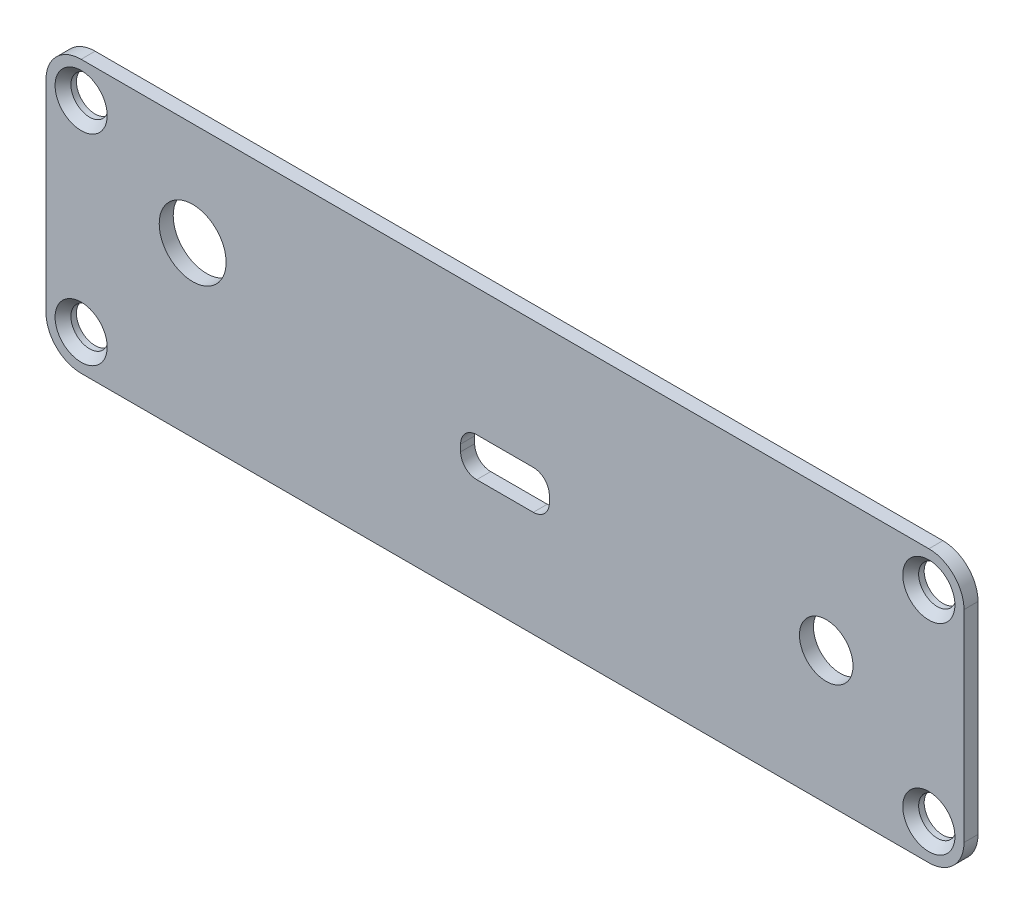
ISO-10303-21;
HEADER;
FILE_DESCRIPTION(('STEP AP214'),'2;1');
FILE_NAME('part.step','',(''),(''),'','','');
FILE_SCHEMA(('AUTOMOTIVE_DESIGN { 1 0 10303 214 1 1 1 1 }'));
ENDSEC;
DATA;
#1=APPLICATION_CONTEXT('core data for automotive mechanical design processes');
#2=APPLICATION_PROTOCOL_DEFINITION('international standard','automotive_design',2000,#1);
#3=PRODUCT_CONTEXT('',#1,'mechanical');
#4=PRODUCT('Part','Part','',(#3));
#5=PRODUCT_RELATED_PRODUCT_CATEGORY('part','',(#4));
#6=PRODUCT_DEFINITION_FORMATION('','',#4);
#7=PRODUCT_DEFINITION_CONTEXT('part definition',#1,'design');
#8=PRODUCT_DEFINITION('design','',#6,#7);
#9=PRODUCT_DEFINITION_SHAPE('','',#8);
#10=(LENGTH_UNIT() NAMED_UNIT(*) SI_UNIT(.MILLI.,.METRE.));
#11=(NAMED_UNIT(*) PLANE_ANGLE_UNIT() SI_UNIT($,.RADIAN.));
#12=(NAMED_UNIT(*) SI_UNIT($,.STERADIAN.) SOLID_ANGLE_UNIT());
#13=UNCERTAINTY_MEASURE_WITH_UNIT(LENGTH_MEASURE(1.E-05),#10,'distance_accuracy_value','');
#14=(GEOMETRIC_REPRESENTATION_CONTEXT(3) GLOBAL_UNCERTAINTY_ASSIGNED_CONTEXT((#13)) GLOBAL_UNIT_ASSIGNED_CONTEXT((#10,
#11,#12)) REPRESENTATION_CONTEXT('',''));
#15=CARTESIAN_POINT('',(0.,0.,0.));
#16=DIRECTION('',(0.,0.,1.));
#17=DIRECTION('',(1.,0.,0.));
#18=AXIS2_PLACEMENT_3D('',#15,#16,#17);
#19=CARTESIAN_POINT('',(0.,0.,1.57));
#20=DIRECTION('',(0.,0.,-1.));
#21=DIRECTION('',(-1.,0.,0.));
#22=AXIS2_PLACEMENT_3D('',#19,#20,#21);
#23=PLANE('',#22);
#24=CARTESIAN_POINT('',(87.435,14.8495,1.57));
#25=DIRECTION('',(0.,0.,-1.));
#26=DIRECTION('',(-1.,0.,0.));
#27=AXIS2_PLACEMENT_3D('',#24,#25,#26);
#28=CIRCLE('',#27,3.);
#29=CARTESIAN_POINT('',(84.435,14.8495,1.57));
#30=VERTEX_POINT('',#29);
#31=EDGE_CURVE('E315',#30,#30,#28,.T.);
#32=ORIENTED_EDGE('',*,*,#31,.T.);
#33=EDGE_LOOP('',(#32));
#34=FACE_BOUND('',#33,.T.);
#35=DIRECTION('',(-1.,0.,0.));
#36=VECTOR('',#35,1.);
#37=CARTESIAN_POINT('',(48.265,11.8495,1.57));
#38=LINE('',#37,#36);
#39=CARTESIAN_POINT('',(54.605,11.8495,1.57));
#40=VERTEX_POINT('',#39);
#41=CARTESIAN_POINT('',(48.265,11.8495,1.57));
#42=VERTEX_POINT('',#41);
#43=EDGE_CURVE('E167',#40,#42,#38,.T.);
#44=ORIENTED_EDGE('',*,*,#43,.T.);
#45=CARTESIAN_POINT('',(48.265,13.6495,1.57));
#46=DIRECTION('',(0.,0.,-1.));
#47=DIRECTION('',(-1.,0.,0.));
#48=AXIS2_PLACEMENT_3D('',#45,#46,#47);
#49=CIRCLE('',#48,1.8);
#50=CARTESIAN_POINT('',(46.465,13.6495,1.57));
#51=VERTEX_POINT('',#50);
#52=EDGE_CURVE('E352',#42,#51,#49,.T.);
#53=ORIENTED_EDGE('',*,*,#52,.T.);
#54=DIRECTION('',(0.,1.,0.));
#55=VECTOR('',#54,1.);
#56=CARTESIAN_POINT('',(46.465,14.4095,1.57));
#57=LINE('',#56,#55);
#58=CARTESIAN_POINT('',(46.465,14.4095,1.57));
#59=VERTEX_POINT('',#58);
#60=EDGE_CURVE('E339',#51,#59,#57,.T.);
#61=ORIENTED_EDGE('',*,*,#60,.T.);
#62=CARTESIAN_POINT('',(48.265,14.4095,1.57));
#63=DIRECTION('',(0.,0.,-1.));
#64=DIRECTION('',(-1.,0.,0.));
#65=AXIS2_PLACEMENT_3D('',#62,#63,#64);
#66=CIRCLE('',#65,1.8);
#67=CARTESIAN_POINT('',(48.265,16.2095,1.57));
#68=VERTEX_POINT('',#67);
#69=EDGE_CURVE('E348',#59,#68,#66,.T.);
#70=ORIENTED_EDGE('',*,*,#69,.T.);
#71=DIRECTION('',(1.,0.,0.));
#72=VECTOR('',#71,1.);
#73=CARTESIAN_POINT('',(48.265,16.2095,1.57));
#74=LINE('',#73,#72);
#75=CARTESIAN_POINT('',(54.605,16.2095,1.57));
#76=VERTEX_POINT('',#75);
#77=EDGE_CURVE('E354',#68,#76,#74,.T.);
#78=ORIENTED_EDGE('',*,*,#77,.T.);
#79=CARTESIAN_POINT('',(54.605,14.4095,1.57));
#80=DIRECTION('',(0.,0.,-1.));
#81=DIRECTION('',(-1.,0.,0.));
#82=AXIS2_PLACEMENT_3D('',#79,#80,#81);
#83=CIRCLE('',#82,1.8);
#84=CARTESIAN_POINT('',(56.405,14.4095,1.57));
#85=VERTEX_POINT('',#84);
#86=EDGE_CURVE('E359',#76,#85,#83,.T.);
#87=ORIENTED_EDGE('',*,*,#86,.T.);
#88=DIRECTION('',(0.,-1.,0.));
#89=VECTOR('',#88,1.);
#90=CARTESIAN_POINT('',(56.405,14.4095,1.57));
#91=LINE('',#90,#89);
#92=CARTESIAN_POINT('',(56.405,13.6495,1.57));
#93=VERTEX_POINT('',#92);
#94=EDGE_CURVE('E87',#85,#93,#91,.T.);
#95=ORIENTED_EDGE('',*,*,#94,.T.);
#96=CARTESIAN_POINT('',(54.605,13.6495,1.57));
#97=DIRECTION('',(0.,0.,-1.));
#98=DIRECTION('',(-1.,0.,0.));
#99=AXIS2_PLACEMENT_3D('',#96,#97,#98);
#100=CIRCLE('',#99,1.8);
#101=EDGE_CURVE('E193',#93,#40,#100,.T.);
#102=ORIENTED_EDGE('',*,*,#101,.T.);
#103=EDGE_LOOP('',(#44,#53,#61,#70,#78,#87,#95,#102));
#104=FACE_BOUND('',#103,.T.);
#105=CARTESIAN_POINT('',(16.435,18.8995,1.57));
#106=DIRECTION('',(0.,0.,-1.));
#107=DIRECTION('',(-1.,0.,0.));
#108=AXIS2_PLACEMENT_3D('',#105,#106,#107);
#109=CIRCLE('',#108,3.75);
#110=CARTESIAN_POINT('',(12.685,18.8995,1.57));
#111=VERTEX_POINT('',#110);
#112=EDGE_CURVE('E179',#111,#111,#109,.T.);
#113=ORIENTED_EDGE('',*,*,#112,.T.);
#114=EDGE_LOOP('',(#113));
#115=FACE_BOUND('',#114,.T.);
#116=CARTESIAN_POINT('',(3.937,26.4795,1.57));
#117=DIRECTION('',(0.,0.,1.));
#118=DIRECTION('',(1.,0.,0.));
#119=AXIS2_PLACEMENT_3D('',#116,#117,#118);
#120=CIRCLE('',#119,2.921);
#121=CARTESIAN_POINT('',(6.858,26.4795,1.57));
#122=VERTEX_POINT('',#121);
#123=EDGE_CURVE('E318',#122,#122,#120,.T.);
#124=ORIENTED_EDGE('',*,*,#123,.F.);
#125=EDGE_LOOP('',(#124));
#126=FACE_BOUND('',#125,.T.);
#127=CARTESIAN_POINT('',(3.937,4.0005,1.57));
#128=DIRECTION('',(0.,0.,1.));
#129=DIRECTION('',(1.,0.,0.));
#130=AXIS2_PLACEMENT_3D('',#127,#128,#129);
#131=CIRCLE('',#130,2.921);
#132=CARTESIAN_POINT('',(6.858,4.0005,1.57));
#133=VERTEX_POINT('',#132);
#134=EDGE_CURVE('E238',#133,#133,#131,.T.);
#135=ORIENTED_EDGE('',*,*,#134,.F.);
#136=EDGE_LOOP('',(#135));
#137=FACE_BOUND('',#136,.T.);
#138=CARTESIAN_POINT('',(98.933,26.4795,1.57));
#139=DIRECTION('',(0.,0.,1.));
#140=DIRECTION('',(1.,0.,0.));
#141=AXIS2_PLACEMENT_3D('',#138,#139,#140);
#142=CIRCLE('',#141,2.92099999999999);
#143=CARTESIAN_POINT('',(101.854,26.4795,1.57));
#144=VERTEX_POINT('',#143);
#145=EDGE_CURVE('E252',#144,#144,#142,.T.);
#146=ORIENTED_EDGE('',*,*,#145,.F.);
#147=EDGE_LOOP('',(#146));
#148=FACE_BOUND('',#147,.T.);
#149=DIRECTION('',(0.,-1.,0.));
#150=VECTOR('',#149,1.);
#151=CARTESIAN_POINT('',(0.,0.,1.57));
#152=LINE('',#151,#150);
#153=CARTESIAN_POINT('',(0.,26.545,1.57));
#154=VERTEX_POINT('',#153);
#155=CARTESIAN_POINT('',(0.,3.935,1.57));
#156=VERTEX_POINT('',#155);
#157=EDGE_CURVE('E620',#154,#156,#152,.T.);
#158=ORIENTED_EDGE('',*,*,#157,.T.);
#159=CARTESIAN_POINT('',(3.935,3.935,1.57));
#160=DIRECTION('',(0.,0.,-1.));
#161=DIRECTION('',(-1.,0.,0.));
#162=AXIS2_PLACEMENT_3D('',#159,#160,#161);
#163=CIRCLE('',#162,3.935);
#164=CARTESIAN_POINT('',(3.935,0.,1.57));
#165=VERTEX_POINT('',#164);
#166=EDGE_CURVE('E307',#156,#165,#163,.F.);
#167=ORIENTED_EDGE('',*,*,#166,.T.);
#168=DIRECTION('',(1.,0.,0.));
#169=VECTOR('',#168,1.);
#170=CARTESIAN_POINT('',(0.,0.,1.57));
#171=LINE('',#170,#169);
#172=CARTESIAN_POINT('',(98.935,0.,1.57));
#173=VERTEX_POINT('',#172);
#174=EDGE_CURVE('E624',#165,#173,#171,.T.);
#175=ORIENTED_EDGE('',*,*,#174,.T.);
#176=CARTESIAN_POINT('',(98.935,3.935,1.57));
#177=DIRECTION('',(0.,0.,-1.));
#178=DIRECTION('',(-1.,0.,0.));
#179=AXIS2_PLACEMENT_3D('',#176,#177,#178);
#180=CIRCLE('',#179,3.935);
#181=CARTESIAN_POINT('',(102.87,3.935,1.57));
#182=VERTEX_POINT('',#181);
#183=EDGE_CURVE('E305',#173,#182,#180,.F.);
#184=ORIENTED_EDGE('',*,*,#183,.T.);
#185=DIRECTION('',(0.,1.,0.));
#186=VECTOR('',#185,1.);
#187=CARTESIAN_POINT('',(102.87,0.,1.57));
#188=LINE('',#187,#186);
#189=CARTESIAN_POINT('',(102.87,26.545,1.57));
#190=VERTEX_POINT('',#189);
#191=EDGE_CURVE('E628',#182,#190,#188,.T.);
#192=ORIENTED_EDGE('',*,*,#191,.T.);
#193=CARTESIAN_POINT('',(98.935,26.545,1.57));
#194=DIRECTION('',(0.,0.,-1.));
#195=DIRECTION('',(-1.,0.,0.));
#196=AXIS2_PLACEMENT_3D('',#193,#194,#195);
#197=CIRCLE('',#196,3.935);
#198=CARTESIAN_POINT('',(98.935,30.48,1.57));
#199=VERTEX_POINT('',#198);
#200=EDGE_CURVE('E303',#190,#199,#197,.F.);
#201=ORIENTED_EDGE('',*,*,#200,.T.);
#202=DIRECTION('',(-1.,0.,0.));
#203=VECTOR('',#202,1.);
#204=CARTESIAN_POINT('',(0.,30.48,1.57));
#205=LINE('',#204,#203);
#206=CARTESIAN_POINT('',(3.935,30.48,1.57));
#207=VERTEX_POINT('',#206);
#208=EDGE_CURVE('E630',#199,#207,#205,.T.);
#209=ORIENTED_EDGE('',*,*,#208,.T.);
#210=CARTESIAN_POINT('',(3.935,26.545,1.57));
#211=DIRECTION('',(0.,0.,-1.));
#212=DIRECTION('',(-1.,0.,0.));
#213=AXIS2_PLACEMENT_3D('',#210,#211,#212);
#214=CIRCLE('',#213,3.935);
#215=EDGE_CURVE('E301',#207,#154,#214,.F.);
#216=ORIENTED_EDGE('',*,*,#215,.T.);
#217=EDGE_LOOP('',(#158,#167,#175,#184,#192,#201,#209,#216));
#218=FACE_BOUND('',#217,.T.);
#219=CARTESIAN_POINT('',(98.933,4.0005,1.57));
#220=DIRECTION('',(0.,0.,1.));
#221=DIRECTION('',(1.,0.,0.));
#222=AXIS2_PLACEMENT_3D('',#219,#220,#221);
#223=CIRCLE('',#222,2.92099999999999);
#224=CARTESIAN_POINT('',(101.854,4.0005,1.57));
#225=VERTEX_POINT('',#224);
#226=EDGE_CURVE('E264',#225,#225,#223,.T.);
#227=ORIENTED_EDGE('',*,*,#226,.F.);
#228=EDGE_LOOP('',(#227));
#229=FACE_BOUND('',#228,.T.);
#230=ADVANCED_FACE('F38',(#34,#104,#115,#126,#137,#148,#218,#229),#23,.F.);
#231=CARTESIAN_POINT('',(0.,0.,0.));
#232=DIRECTION('',(0.,0.,-1.));
#233=DIRECTION('',(-1.,0.,0.));
#234=AXIS2_PLACEMENT_3D('',#231,#232,#233);
#235=PLANE('',#234);
#236=CARTESIAN_POINT('',(87.435,14.8495,0.));
#237=DIRECTION('',(0.,0.,-1.));
#238=DIRECTION('',(-1.,0.,0.));
#239=AXIS2_PLACEMENT_3D('',#236,#237,#238);
#240=CIRCLE('',#239,3.);
#241=CARTESIAN_POINT('',(84.435,14.8495,0.));
#242=VERTEX_POINT('',#241);
#243=EDGE_CURVE('E319',#242,#242,#240,.F.);
#244=ORIENTED_EDGE('',*,*,#243,.T.);
#245=EDGE_LOOP('',(#244));
#246=FACE_BOUND('',#245,.T.);
#247=CARTESIAN_POINT('',(48.265,13.6495,0.));
#248=DIRECTION('',(0.,0.,-1.));
#249=DIRECTION('',(-1.,0.,0.));
#250=AXIS2_PLACEMENT_3D('',#247,#248,#249);
#251=CIRCLE('',#250,1.8);
#252=CARTESIAN_POINT('',(46.465,13.6495,0.));
#253=VERTEX_POINT('',#252);
#254=CARTESIAN_POINT('',(48.265,11.8495,0.));
#255=VERTEX_POINT('',#254);
#256=EDGE_CURVE('E184',#253,#255,#251,.F.);
#257=ORIENTED_EDGE('',*,*,#256,.T.);
#258=DIRECTION('',(1.,0.,0.));
#259=VECTOR('',#258,1.);
#260=CARTESIAN_POINT('',(0.,11.8495,0.));
#261=LINE('',#260,#259);
#262=CARTESIAN_POINT('',(54.605,11.8495,0.));
#263=VERTEX_POINT('',#262);
#264=EDGE_CURVE('E164',#255,#263,#261,.T.);
#265=ORIENTED_EDGE('',*,*,#264,.T.);
#266=CARTESIAN_POINT('',(54.605,13.6495,0.));
#267=DIRECTION('',(0.,0.,-1.));
#268=DIRECTION('',(-1.,0.,0.));
#269=AXIS2_PLACEMENT_3D('',#266,#267,#268);
#270=CIRCLE('',#269,1.8);
#271=CARTESIAN_POINT('',(56.405,13.6495,0.));
#272=VERTEX_POINT('',#271);
#273=EDGE_CURVE('E172',#263,#272,#270,.F.);
#274=ORIENTED_EDGE('',*,*,#273,.T.);
#275=DIRECTION('',(0.,1.,0.));
#276=VECTOR('',#275,1.);
#277=CARTESIAN_POINT('',(56.405,0.,0.));
#278=LINE('',#277,#276);
#279=CARTESIAN_POINT('',(56.405,14.4095,0.));
#280=VERTEX_POINT('',#279);
#281=EDGE_CURVE('E178',#272,#280,#278,.T.);
#282=ORIENTED_EDGE('',*,*,#281,.T.);
#283=CARTESIAN_POINT('',(54.605,14.4095,0.));
#284=DIRECTION('',(0.,0.,-1.));
#285=DIRECTION('',(-1.,0.,0.));
#286=AXIS2_PLACEMENT_3D('',#283,#284,#285);
#287=CIRCLE('',#286,1.8);
#288=CARTESIAN_POINT('',(54.605,16.2095,0.));
#289=VERTEX_POINT('',#288);
#290=EDGE_CURVE('E209',#280,#289,#287,.F.);
#291=ORIENTED_EDGE('',*,*,#290,.T.);
#292=DIRECTION('',(-1.,0.,0.));
#293=VECTOR('',#292,1.);
#294=CARTESIAN_POINT('',(0.,16.2095,0.));
#295=LINE('',#294,#293);
#296=CARTESIAN_POINT('',(48.265,16.2095,0.));
#297=VERTEX_POINT('',#296);
#298=EDGE_CURVE('E215',#289,#297,#295,.T.);
#299=ORIENTED_EDGE('',*,*,#298,.T.);
#300=CARTESIAN_POINT('',(48.265,14.4095,0.));
#301=DIRECTION('',(0.,0.,-1.));
#302=DIRECTION('',(-1.,0.,0.));
#303=AXIS2_PLACEMENT_3D('',#300,#301,#302);
#304=CIRCLE('',#303,1.8);
#305=CARTESIAN_POINT('',(46.465,14.4095,0.));
#306=VERTEX_POINT('',#305);
#307=EDGE_CURVE('E220',#297,#306,#304,.F.);
#308=ORIENTED_EDGE('',*,*,#307,.T.);
#309=DIRECTION('',(0.,-1.,0.));
#310=VECTOR('',#309,1.);
#311=CARTESIAN_POINT('',(46.465,0.,0.));
#312=LINE('',#311,#310);
#313=EDGE_CURVE('E188',#306,#253,#312,.T.);
#314=ORIENTED_EDGE('',*,*,#313,.T.);
#315=EDGE_LOOP('',(#257,#265,#274,#282,#291,#299,#308,#314));
#316=FACE_BOUND('',#315,.T.);
#317=CARTESIAN_POINT('',(16.435,18.8995,0.));
#318=DIRECTION('',(0.,0.,-1.));
#319=DIRECTION('',(-1.,0.,0.));
#320=AXIS2_PLACEMENT_3D('',#317,#318,#319);
#321=CIRCLE('',#320,3.75);
#322=CARTESIAN_POINT('',(12.685,18.8995,0.));
#323=VERTEX_POINT('',#322);
#324=EDGE_CURVE('E42',#323,#323,#321,.F.);
#325=ORIENTED_EDGE('',*,*,#324,.T.);
#326=EDGE_LOOP('',(#325));
#327=FACE_BOUND('',#326,.T.);
#328=CARTESIAN_POINT('',(3.937,26.4795,0.));
#329=DIRECTION('',(0.,0.,1.));
#330=DIRECTION('',(1.,0.,0.));
#331=AXIS2_PLACEMENT_3D('',#328,#329,#330);
#332=CIRCLE('',#331,2.0955);
#333=CARTESIAN_POINT('',(6.0325,26.4795,0.));
#334=VERTEX_POINT('',#333);
#335=EDGE_CURVE('E232',#334,#334,#332,.T.);
#336=ORIENTED_EDGE('',*,*,#335,.T.);
#337=EDGE_LOOP('',(#336));
#338=FACE_BOUND('',#337,.T.);
#339=CARTESIAN_POINT('',(3.937,4.0005,0.));
#340=DIRECTION('',(0.,0.,1.));
#341=DIRECTION('',(1.,0.,0.));
#342=AXIS2_PLACEMENT_3D('',#339,#340,#341);
#343=CIRCLE('',#342,2.0955);
#344=CARTESIAN_POINT('',(6.0325,4.0005,0.));
#345=VERTEX_POINT('',#344);
#346=EDGE_CURVE('E247',#345,#345,#343,.T.);
#347=ORIENTED_EDGE('',*,*,#346,.T.);
#348=EDGE_LOOP('',(#347));
#349=FACE_BOUND('',#348,.T.);
#350=CARTESIAN_POINT('',(98.933,26.4795,0.));
#351=DIRECTION('',(0.,0.,1.));
#352=DIRECTION('',(1.,0.,0.));
#353=AXIS2_PLACEMENT_3D('',#350,#351,#352);
#354=CIRCLE('',#353,2.0955);
#355=CARTESIAN_POINT('',(101.0285,26.4795,0.));
#356=VERTEX_POINT('',#355);
#357=EDGE_CURVE('E259',#356,#356,#354,.T.);
#358=ORIENTED_EDGE('',*,*,#357,.T.);
#359=EDGE_LOOP('',(#358));
#360=FACE_BOUND('',#359,.T.);
#361=DIRECTION('',(1.,0.,0.));
#362=VECTOR('',#361,1.);
#363=CARTESIAN_POINT('',(0.,0.,0.));
#364=LINE('',#363,#362);
#365=CARTESIAN_POINT('',(3.935,0.,0.));
#366=VERTEX_POINT('',#365);
#367=CARTESIAN_POINT('',(98.935,0.,0.));
#368=VERTEX_POINT('',#367);
#369=EDGE_CURVE('E272',#366,#368,#364,.T.);
#370=ORIENTED_EDGE('',*,*,#369,.F.);
#371=CARTESIAN_POINT('',(3.935,3.935,0.));
#372=DIRECTION('',(0.,0.,-1.));
#373=DIRECTION('',(-1.,0.,0.));
#374=AXIS2_PLACEMENT_3D('',#371,#372,#373);
#375=CIRCLE('',#374,3.935);
#376=CARTESIAN_POINT('',(0.,3.935,0.));
#377=VERTEX_POINT('',#376);
#378=EDGE_CURVE('E96',#366,#377,#375,.T.);
#379=ORIENTED_EDGE('',*,*,#378,.T.);
#380=DIRECTION('',(0.,-1.,0.));
#381=VECTOR('',#380,1.);
#382=CARTESIAN_POINT('',(0.,0.,0.));
#383=LINE('',#382,#381);
#384=CARTESIAN_POINT('',(0.,26.545,0.));
#385=VERTEX_POINT('',#384);
#386=EDGE_CURVE('E279',#385,#377,#383,.T.);
#387=ORIENTED_EDGE('',*,*,#386,.F.);
#388=CARTESIAN_POINT('',(3.935,26.545,0.));
#389=DIRECTION('',(0.,0.,-1.));
#390=DIRECTION('',(-1.,0.,0.));
#391=AXIS2_PLACEMENT_3D('',#388,#389,#390);
#392=CIRCLE('',#391,3.935);
#393=CARTESIAN_POINT('',(3.935,30.48,0.));
#394=VERTEX_POINT('',#393);
#395=EDGE_CURVE('E640',#385,#394,#392,.T.);
#396=ORIENTED_EDGE('',*,*,#395,.T.);
#397=DIRECTION('',(-1.,0.,0.));
#398=VECTOR('',#397,1.);
#399=CARTESIAN_POINT('',(0.,30.48,0.));
#400=LINE('',#399,#398);
#401=CARTESIAN_POINT('',(98.935,30.48,0.));
#402=VERTEX_POINT('',#401);
#403=EDGE_CURVE('E625',#402,#394,#400,.T.);
#404=ORIENTED_EDGE('',*,*,#403,.F.);
#405=CARTESIAN_POINT('',(98.935,26.545,0.));
#406=DIRECTION('',(0.,0.,-1.));
#407=DIRECTION('',(-1.,0.,0.));
#408=AXIS2_PLACEMENT_3D('',#405,#406,#407);
#409=CIRCLE('',#408,3.935);
#410=CARTESIAN_POINT('',(102.87,26.545,0.));
#411=VERTEX_POINT('',#410);
#412=EDGE_CURVE('E646',#402,#411,#409,.T.);
#413=ORIENTED_EDGE('',*,*,#412,.T.);
#414=DIRECTION('',(0.,1.,0.));
#415=VECTOR('',#414,1.);
#416=CARTESIAN_POINT('',(102.87,0.,0.));
#417=LINE('',#416,#415);
#418=CARTESIAN_POINT('',(102.87,3.935,0.));
#419=VERTEX_POINT('',#418);
#420=EDGE_CURVE('E278',#419,#411,#417,.T.);
#421=ORIENTED_EDGE('',*,*,#420,.F.);
#422=CARTESIAN_POINT('',(98.935,3.935,0.));
#423=DIRECTION('',(0.,0.,-1.));
#424=DIRECTION('',(-1.,0.,0.));
#425=AXIS2_PLACEMENT_3D('',#422,#423,#424);
#426=CIRCLE('',#425,3.935);
#427=EDGE_CURVE('E293',#419,#368,#426,.T.);
#428=ORIENTED_EDGE('',*,*,#427,.T.);
#429=EDGE_LOOP('',(#370,#379,#387,#396,#404,#413,#421,#428));
#430=FACE_BOUND('',#429,.T.);
#431=CARTESIAN_POINT('',(98.933,4.0005,0.));
#432=DIRECTION('',(0.,0.,1.));
#433=DIRECTION('',(1.,0.,0.));
#434=AXIS2_PLACEMENT_3D('',#431,#432,#433);
#435=CIRCLE('',#434,2.0955);
#436=CARTESIAN_POINT('',(101.0285,4.0005,0.));
#437=VERTEX_POINT('',#436);
#438=EDGE_CURVE('E612',#437,#437,#435,.T.);
#439=ORIENTED_EDGE('',*,*,#438,.T.);
#440=EDGE_LOOP('',(#439));
#441=FACE_BOUND('',#440,.T.);
#442=ADVANCED_FACE('F181',(#246,#316,#327,#338,#349,#360,#430,#441),#235,.T.);
#443=CARTESIAN_POINT('',(0.,0.,1.57));
#444=DIRECTION('',(1.,0.,0.));
#445=DIRECTION('',(0.,0.,-1.));
#446=AXIS2_PLACEMENT_3D('',#443,#444,#445);
#447=PLANE('',#446);
#448=ORIENTED_EDGE('',*,*,#386,.T.);
#449=DIRECTION('',(0.,0.,-1.));
#450=VECTOR('',#449,1.);
#451=CARTESIAN_POINT('',(0.,3.935,1.57));
#452=LINE('',#451,#450);
#453=EDGE_CURVE('E299',#377,#156,#452,.F.);
#454=ORIENTED_EDGE('',*,*,#453,.T.);
#455=ORIENTED_EDGE('',*,*,#157,.F.);
#456=DIRECTION('',(0.,0.,-1.));
#457=VECTOR('',#456,1.);
#458=CARTESIAN_POINT('',(0.,26.545,1.57));
#459=LINE('',#458,#457);
#460=EDGE_CURVE('E292',#154,#385,#459,.T.);
#461=ORIENTED_EDGE('',*,*,#460,.T.);
#462=EDGE_LOOP('',(#448,#454,#455,#461));
#463=FACE_BOUND('',#462,.T.);
#464=ADVANCED_FACE('F390',(#463),#447,.F.);
#465=CARTESIAN_POINT('',(0.,0.,1.57));
#466=DIRECTION('',(0.,1.,0.));
#467=DIRECTION('',(0.,0.,1.));
#468=AXIS2_PLACEMENT_3D('',#465,#466,#467);
#469=PLANE('',#468);
#470=ORIENTED_EDGE('',*,*,#174,.F.);
#471=DIRECTION('',(0.,0.,-1.));
#472=VECTOR('',#471,1.);
#473=CARTESIAN_POINT('',(3.935,0.,1.57));
#474=LINE('',#473,#472);
#475=EDGE_CURVE('E636',#165,#366,#474,.T.);
#476=ORIENTED_EDGE('',*,*,#475,.T.);
#477=ORIENTED_EDGE('',*,*,#369,.T.);
#478=DIRECTION('',(0.,0.,-1.));
#479=VECTOR('',#478,1.);
#480=CARTESIAN_POINT('',(98.935,0.,1.57));
#481=LINE('',#480,#479);
#482=EDGE_CURVE('E632',#368,#173,#481,.F.);
#483=ORIENTED_EDGE('',*,*,#482,.T.);
#484=EDGE_LOOP('',(#470,#476,#477,#483));
#485=FACE_BOUND('',#484,.T.);
#486=ADVANCED_FACE('F405',(#485),#469,.F.);
#487=CARTESIAN_POINT('',(102.87,0.,1.57));
#488=DIRECTION('',(-1.,0.,0.));
#489=DIRECTION('',(0.,0.,1.));
#490=AXIS2_PLACEMENT_3D('',#487,#488,#489);
#491=PLANE('',#490);
#492=ORIENTED_EDGE('',*,*,#191,.F.);
#493=DIRECTION('',(0.,0.,-1.));
#494=VECTOR('',#493,1.);
#495=CARTESIAN_POINT('',(102.87,3.935,1.57));
#496=LINE('',#495,#494);
#497=EDGE_CURVE('E311',#182,#419,#496,.T.);
#498=ORIENTED_EDGE('',*,*,#497,.T.);
#499=ORIENTED_EDGE('',*,*,#420,.T.);
#500=DIRECTION('',(0.,0.,-1.));
#501=VECTOR('',#500,1.);
#502=CARTESIAN_POINT('',(102.87,26.545,1.57));
#503=LINE('',#502,#501);
#504=EDGE_CURVE('E309',#411,#190,#503,.F.);
#505=ORIENTED_EDGE('',*,*,#504,.T.);
#506=EDGE_LOOP('',(#492,#498,#499,#505));
#507=FACE_BOUND('',#506,.T.);
#508=ADVANCED_FACE('F401',(#507),#491,.F.);
#509=CARTESIAN_POINT('',(0.,30.48,1.57));
#510=DIRECTION('',(0.,-1.,0.));
#511=DIRECTION('',(0.,0.,-1.));
#512=AXIS2_PLACEMENT_3D('',#509,#510,#511);
#513=PLANE('',#512);
#514=ORIENTED_EDGE('',*,*,#208,.F.);
#515=DIRECTION('',(0.,0.,-1.));
#516=VECTOR('',#515,1.);
#517=CARTESIAN_POINT('',(98.935,30.48,1.57));
#518=LINE('',#517,#516);
#519=EDGE_CURVE('E13',#199,#402,#518,.T.);
#520=ORIENTED_EDGE('',*,*,#519,.T.);
#521=ORIENTED_EDGE('',*,*,#403,.T.);
#522=DIRECTION('',(0.,0.,-1.));
#523=VECTOR('',#522,1.);
#524=CARTESIAN_POINT('',(3.935,30.48,1.57));
#525=LINE('',#524,#523);
#526=EDGE_CURVE('E48',#394,#207,#525,.F.);
#527=ORIENTED_EDGE('',*,*,#526,.T.);
#528=EDGE_LOOP('',(#514,#520,#521,#527));
#529=FACE_BOUND('',#528,.T.);
#530=ADVANCED_FACE('F397',(#529),#513,.F.);
#531=CARTESIAN_POINT('',(3.935,3.935,1.57));
#532=DIRECTION('',(0.,0.,-1.));
#533=DIRECTION('',(-1.,0.,0.));
#534=AXIS2_PLACEMENT_3D('',#531,#532,#533);
#535=CYLINDRICAL_SURFACE('',#534,3.935);
#536=ORIENTED_EDGE('',*,*,#166,.F.);
#537=ORIENTED_EDGE('',*,*,#453,.F.);
#538=ORIENTED_EDGE('',*,*,#378,.F.);
#539=ORIENTED_EDGE('',*,*,#475,.F.);
#540=EDGE_LOOP('',(#536,#537,#538,#539));
#541=FACE_BOUND('',#540,.T.);
#542=ADVANCED_FACE('F400',(#541),#535,.T.);
#543=CARTESIAN_POINT('',(98.935,3.935,1.57));
#544=DIRECTION('',(0.,0.,-1.));
#545=DIRECTION('',(-1.,0.,0.));
#546=AXIS2_PLACEMENT_3D('',#543,#544,#545);
#547=CYLINDRICAL_SURFACE('',#546,3.935);
#548=ORIENTED_EDGE('',*,*,#183,.F.);
#549=ORIENTED_EDGE('',*,*,#482,.F.);
#550=ORIENTED_EDGE('',*,*,#427,.F.);
#551=ORIENTED_EDGE('',*,*,#497,.F.);
#552=EDGE_LOOP('',(#548,#549,#550,#551));
#553=FACE_BOUND('',#552,.T.);
#554=ADVANCED_FACE('F415',(#553),#547,.T.);
#555=CARTESIAN_POINT('',(98.935,26.545,1.57));
#556=DIRECTION('',(0.,0.,-1.));
#557=DIRECTION('',(-1.,0.,0.));
#558=AXIS2_PLACEMENT_3D('',#555,#556,#557);
#559=CYLINDRICAL_SURFACE('',#558,3.935);
#560=ORIENTED_EDGE('',*,*,#200,.F.);
#561=ORIENTED_EDGE('',*,*,#504,.F.);
#562=ORIENTED_EDGE('',*,*,#412,.F.);
#563=ORIENTED_EDGE('',*,*,#519,.F.);
#564=EDGE_LOOP('',(#560,#561,#562,#563));
#565=FACE_BOUND('',#564,.T.);
#566=ADVANCED_FACE('F418',(#565),#559,.T.);
#567=CARTESIAN_POINT('',(3.935,26.545,1.57));
#568=DIRECTION('',(0.,0.,-1.));
#569=DIRECTION('',(-1.,0.,0.));
#570=AXIS2_PLACEMENT_3D('',#567,#568,#569);
#571=CYLINDRICAL_SURFACE('',#570,3.935);
#572=ORIENTED_EDGE('',*,*,#215,.F.);
#573=ORIENTED_EDGE('',*,*,#526,.F.);
#574=ORIENTED_EDGE('',*,*,#395,.F.);
#575=ORIENTED_EDGE('',*,*,#460,.F.);
#576=EDGE_LOOP('',(#572,#573,#574,#575));
#577=FACE_BOUND('',#576,.T.);
#578=ADVANCED_FACE('F422',(#577),#571,.T.);
#579=CARTESIAN_POINT('',(98.933,4.0005,1.57));
#580=DIRECTION('',(0.,0.,1.));
#581=DIRECTION('',(1.,0.,0.));
#582=AXIS2_PLACEMENT_3D('',#579,#580,#581);
#583=CYLINDRICAL_SURFACE('',#582,2.0955);
#584=ORIENTED_EDGE('',*,*,#438,.F.);
#585=EDGE_LOOP('',(#584));
#586=FACE_BOUND('',#585,.T.);
#587=CARTESIAN_POINT('',(98.933,4.0005,0.620370879839058));
#588=DIRECTION('',(0.,0.,1.));
#589=DIRECTION('',(1.,0.,0.));
#590=AXIS2_PLACEMENT_3D('',#587,#588,#589);
#591=CIRCLE('',#590,2.0955);
#592=CARTESIAN_POINT('',(101.0285,4.0005,0.620370879839058));
#593=VERTEX_POINT('',#592);
#594=EDGE_CURVE('E615',#593,#593,#591,.T.);
#595=ORIENTED_EDGE('',*,*,#594,.T.);
#596=EDGE_LOOP('',(#595));
#597=FACE_BOUND('',#596,.T.);
#598=ADVANCED_FACE('F394',(#586,#597),#583,.F.);
#599=CARTESIAN_POINT('',(98.933,4.0005,1.57));
#600=DIRECTION('',(0.,0.,1.));
#601=DIRECTION('',(1.,0.,0.));
#602=AXIS2_PLACEMENT_3D('',#599,#600,#601);
#603=CONICAL_SURFACE('',#602,2.92099999999999,0.715584993317672);
#604=ORIENTED_EDGE('',*,*,#594,.F.);
#605=EDGE_LOOP('',(#604));
#606=FACE_BOUND('',#605,.T.);
#607=ORIENTED_EDGE('',*,*,#226,.T.);
#608=EDGE_LOOP('',(#607));
#609=FACE_BOUND('',#608,.T.);
#610=ADVANCED_FACE('F542',(#606,#609),#603,.F.);
#611=CARTESIAN_POINT('',(98.933,26.4795,1.57));
#612=DIRECTION('',(0.,0.,1.));
#613=DIRECTION('',(1.,0.,0.));
#614=AXIS2_PLACEMENT_3D('',#611,#612,#613);
#615=CYLINDRICAL_SURFACE('',#614,2.0955);
#616=ORIENTED_EDGE('',*,*,#357,.F.);
#617=EDGE_LOOP('',(#616));
#618=FACE_BOUND('',#617,.T.);
#619=CARTESIAN_POINT('',(98.933,26.4795,0.620370879839058));
#620=DIRECTION('',(0.,0.,1.));
#621=DIRECTION('',(1.,0.,0.));
#622=AXIS2_PLACEMENT_3D('',#619,#620,#621);
#623=CIRCLE('',#622,2.0955);
#624=CARTESIAN_POINT('',(101.0285,26.4795,0.620370879839058));
#625=VERTEX_POINT('',#624);
#626=EDGE_CURVE('E257',#625,#625,#623,.T.);
#627=ORIENTED_EDGE('',*,*,#626,.T.);
#628=EDGE_LOOP('',(#627));
#629=FACE_BOUND('',#628,.T.);
#630=ADVANCED_FACE('F532',(#618,#629),#615,.F.);
#631=CARTESIAN_POINT('',(98.933,26.4795,1.57));
#632=DIRECTION('',(0.,0.,1.));
#633=DIRECTION('',(1.,0.,0.));
#634=AXIS2_PLACEMENT_3D('',#631,#632,#633);
#635=CONICAL_SURFACE('',#634,2.92099999999999,0.715584993317672);
#636=ORIENTED_EDGE('',*,*,#626,.F.);
#637=EDGE_LOOP('',(#636));
#638=FACE_BOUND('',#637,.T.);
#639=ORIENTED_EDGE('',*,*,#145,.T.);
#640=EDGE_LOOP('',(#639));
#641=FACE_BOUND('',#640,.T.);
#642=ADVANCED_FACE('F522',(#638,#641),#635,.F.);
#643=CARTESIAN_POINT('',(3.937,4.0005,1.57));
#644=DIRECTION('',(0.,0.,1.));
#645=DIRECTION('',(1.,0.,0.));
#646=AXIS2_PLACEMENT_3D('',#643,#644,#645);
#647=CYLINDRICAL_SURFACE('',#646,2.0955);
#648=ORIENTED_EDGE('',*,*,#346,.F.);
#649=EDGE_LOOP('',(#648));
#650=FACE_BOUND('',#649,.T.);
#651=CARTESIAN_POINT('',(3.937,4.0005,0.620370879839058));
#652=DIRECTION('',(0.,0.,1.));
#653=DIRECTION('',(1.,0.,0.));
#654=AXIS2_PLACEMENT_3D('',#651,#652,#653);
#655=CIRCLE('',#654,2.0955);
#656=CARTESIAN_POINT('',(6.0325,4.0005,0.620370879839058));
#657=VERTEX_POINT('',#656);
#658=EDGE_CURVE('E253',#657,#657,#655,.T.);
#659=ORIENTED_EDGE('',*,*,#658,.T.);
#660=EDGE_LOOP('',(#659));
#661=FACE_BOUND('',#660,.T.);
#662=ADVANCED_FACE('F512',(#650,#661),#647,.F.);
#663=CARTESIAN_POINT('',(3.937,4.0005,1.57));
#664=DIRECTION('',(0.,0.,1.));
#665=DIRECTION('',(1.,0.,0.));
#666=AXIS2_PLACEMENT_3D('',#663,#664,#665);
#667=CONICAL_SURFACE('',#666,2.921,0.715584993317676);
#668=ORIENTED_EDGE('',*,*,#658,.F.);
#669=EDGE_LOOP('',(#668));
#670=FACE_BOUND('',#669,.T.);
#671=ORIENTED_EDGE('',*,*,#134,.T.);
#672=EDGE_LOOP('',(#671));
#673=FACE_BOUND('',#672,.T.);
#674=ADVANCED_FACE('F502',(#670,#673),#667,.F.);
#675=CARTESIAN_POINT('',(3.937,26.4795,1.57));
#676=DIRECTION('',(0.,0.,1.));
#677=DIRECTION('',(1.,0.,0.));
#678=AXIS2_PLACEMENT_3D('',#675,#676,#677);
#679=CYLINDRICAL_SURFACE('',#678,2.0955);
#680=ORIENTED_EDGE('',*,*,#335,.F.);
#681=EDGE_LOOP('',(#680));
#682=FACE_BOUND('',#681,.T.);
#683=CARTESIAN_POINT('',(3.937,26.4795,0.620370879839058));
#684=DIRECTION('',(0.,0.,1.));
#685=DIRECTION('',(1.,0.,0.));
#686=AXIS2_PLACEMENT_3D('',#683,#684,#685);
#687=CIRCLE('',#686,2.0955);
#688=CARTESIAN_POINT('',(6.0325,26.4795,0.620370879839058));
#689=VERTEX_POINT('',#688);
#690=EDGE_CURVE('E239',#689,#689,#687,.T.);
#691=ORIENTED_EDGE('',*,*,#690,.T.);
#692=EDGE_LOOP('',(#691));
#693=FACE_BOUND('',#692,.T.);
#694=ADVANCED_FACE('F379',(#682,#693),#679,.F.);
#695=CARTESIAN_POINT('',(3.937,26.4795,1.57));
#696=DIRECTION('',(0.,0.,1.));
#697=DIRECTION('',(1.,0.,0.));
#698=AXIS2_PLACEMENT_3D('',#695,#696,#697);
#699=CONICAL_SURFACE('',#698,2.921,0.715584993317676);
#700=ORIENTED_EDGE('',*,*,#690,.F.);
#701=EDGE_LOOP('',(#700));
#702=FACE_BOUND('',#701,.T.);
#703=ORIENTED_EDGE('',*,*,#123,.T.);
#704=EDGE_LOOP('',(#703));
#705=FACE_BOUND('',#704,.T.);
#706=ADVANCED_FACE('F371',(#702,#705),#699,.F.);
#707=CARTESIAN_POINT('',(16.435,18.8995,11.1205601929939));
#708=DIRECTION('',(0.,0.,-1.));
#709=DIRECTION('',(-1.,0.,0.));
#710=AXIS2_PLACEMENT_3D('',#707,#708,#709);
#711=CYLINDRICAL_SURFACE('',#710,3.75);
#712=ORIENTED_EDGE('',*,*,#112,.F.);
#713=EDGE_LOOP('',(#712));
#714=FACE_BOUND('',#713,.T.);
#715=ORIENTED_EDGE('',*,*,#324,.F.);
#716=EDGE_LOOP('',(#715));
#717=FACE_BOUND('',#716,.T.);
#718=ADVANCED_FACE('F369',(#714,#717),#711,.F.);
#719=CARTESIAN_POINT('',(48.265,11.8495,11.1205601929939));
#720=DIRECTION('',(0.,1.,0.));
#721=DIRECTION('',(0.,0.,1.));
#722=AXIS2_PLACEMENT_3D('',#719,#720,#721);
#723=PLANE('',#722);
#724=DIRECTION('',(0.,0.,1.));
#725=VECTOR('',#724,1.);
#726=CARTESIAN_POINT('',(54.605,11.8495,11.1205601929939));
#727=LINE('',#726,#725);
#728=EDGE_CURVE('E57',#40,#263,#727,.F.);
#729=ORIENTED_EDGE('',*,*,#728,.T.);
#730=ORIENTED_EDGE('',*,*,#264,.F.);
#731=DIRECTION('',(0.,0.,-1.));
#732=VECTOR('',#731,1.);
#733=CARTESIAN_POINT('',(48.265,11.8495,11.1205601929939));
#734=LINE('',#733,#732);
#735=EDGE_CURVE('E159',#42,#255,#734,.T.);
#736=ORIENTED_EDGE('',*,*,#735,.F.);
#737=ORIENTED_EDGE('',*,*,#43,.F.);
#738=EDGE_LOOP('',(#729,#730,#736,#737));
#739=FACE_BOUND('',#738,.T.);
#740=ADVANCED_FACE('F162',(#739),#723,.T.);
#741=CARTESIAN_POINT('',(48.265,13.6495,11.1205601929939));
#742=DIRECTION('',(0.,0.,-1.));
#743=DIRECTION('',(-1.,0.,0.));
#744=AXIS2_PLACEMENT_3D('',#741,#742,#743);
#745=CYLINDRICAL_SURFACE('',#744,1.8);
#746=ORIENTED_EDGE('',*,*,#735,.T.);
#747=ORIENTED_EDGE('',*,*,#256,.F.);
#748=DIRECTION('',(0.,0.,-1.));
#749=VECTOR('',#748,1.);
#750=CARTESIAN_POINT('',(46.465,13.6495,11.1205601929939));
#751=LINE('',#750,#749);
#752=EDGE_CURVE('E332',#51,#253,#751,.T.);
#753=ORIENTED_EDGE('',*,*,#752,.F.);
#754=ORIENTED_EDGE('',*,*,#52,.F.);
#755=EDGE_LOOP('',(#746,#747,#753,#754));
#756=FACE_BOUND('',#755,.T.);
#757=ADVANCED_FACE('F341',(#756),#745,.F.);
#758=CARTESIAN_POINT('',(46.465,14.4095,11.1205601929939));
#759=DIRECTION('',(1.,0.,0.));
#760=DIRECTION('',(0.,0.,-1.));
#761=AXIS2_PLACEMENT_3D('',#758,#759,#760);
#762=PLANE('',#761);
#763=ORIENTED_EDGE('',*,*,#752,.T.);
#764=ORIENTED_EDGE('',*,*,#313,.F.);
#765=DIRECTION('',(0.,0.,-1.));
#766=VECTOR('',#765,1.);
#767=CARTESIAN_POINT('',(46.465,14.4095,11.1205601929939));
#768=LINE('',#767,#766);
#769=EDGE_CURVE('E330',#59,#306,#768,.T.);
#770=ORIENTED_EDGE('',*,*,#769,.F.);
#771=ORIENTED_EDGE('',*,*,#60,.F.);
#772=EDGE_LOOP('',(#763,#764,#770,#771));
#773=FACE_BOUND('',#772,.T.);
#774=ADVANCED_FACE('F336',(#773),#762,.T.);
#775=CARTESIAN_POINT('',(48.265,14.4095,11.1205601929939));
#776=DIRECTION('',(0.,0.,-1.));
#777=DIRECTION('',(-1.,0.,0.));
#778=AXIS2_PLACEMENT_3D('',#775,#776,#777);
#779=CYLINDRICAL_SURFACE('',#778,1.8);
#780=ORIENTED_EDGE('',*,*,#769,.T.);
#781=ORIENTED_EDGE('',*,*,#307,.F.);
#782=DIRECTION('',(0.,0.,-1.));
#783=VECTOR('',#782,1.);
#784=CARTESIAN_POINT('',(48.265,16.2095,11.1205601929939));
#785=LINE('',#784,#783);
#786=EDGE_CURVE('E328',#68,#297,#785,.T.);
#787=ORIENTED_EDGE('',*,*,#786,.F.);
#788=ORIENTED_EDGE('',*,*,#69,.F.);
#789=EDGE_LOOP('',(#780,#781,#787,#788));
#790=FACE_BOUND('',#789,.T.);
#791=ADVANCED_FACE('F40',(#790),#779,.F.);
#792=CARTESIAN_POINT('',(48.265,16.2095,11.1205601929939));
#793=DIRECTION('',(0.,-1.,0.));
#794=DIRECTION('',(0.,0.,-1.));
#795=AXIS2_PLACEMENT_3D('',#792,#793,#794);
#796=PLANE('',#795);
#797=ORIENTED_EDGE('',*,*,#786,.T.);
#798=ORIENTED_EDGE('',*,*,#298,.F.);
#799=DIRECTION('',(0.,0.,-1.));
#800=VECTOR('',#799,1.);
#801=CARTESIAN_POINT('',(54.605,16.2095,11.1205601929939));
#802=LINE('',#801,#800);
#803=EDGE_CURVE('E326',#76,#289,#802,.T.);
#804=ORIENTED_EDGE('',*,*,#803,.F.);
#805=ORIENTED_EDGE('',*,*,#77,.F.);
#806=EDGE_LOOP('',(#797,#798,#804,#805));
#807=FACE_BOUND('',#806,.T.);
#808=ADVANCED_FACE('F443',(#807),#796,.T.);
#809=CARTESIAN_POINT('',(54.605,14.4095,11.1205601929939));
#810=DIRECTION('',(0.,0.,-1.));
#811=DIRECTION('',(-1.,0.,0.));
#812=AXIS2_PLACEMENT_3D('',#809,#810,#811);
#813=CYLINDRICAL_SURFACE('',#812,1.8);
#814=ORIENTED_EDGE('',*,*,#803,.T.);
#815=ORIENTED_EDGE('',*,*,#290,.F.);
#816=DIRECTION('',(0.,0.,1.));
#817=VECTOR('',#816,1.);
#818=CARTESIAN_POINT('',(56.405,14.4095,11.1205601929939));
#819=LINE('',#818,#817);
#820=EDGE_CURVE('E323',#85,#280,#819,.F.);
#821=ORIENTED_EDGE('',*,*,#820,.F.);
#822=ORIENTED_EDGE('',*,*,#86,.F.);
#823=EDGE_LOOP('',(#814,#815,#821,#822));
#824=FACE_BOUND('',#823,.T.);
#825=ADVANCED_FACE('F439',(#824),#813,.F.);
#826=CARTESIAN_POINT('',(56.405,14.4095,11.1205601929939));
#827=DIRECTION('',(-1.,0.,0.));
#828=DIRECTION('',(0.,0.,1.));
#829=AXIS2_PLACEMENT_3D('',#826,#827,#828);
#830=PLANE('',#829);
#831=ORIENTED_EDGE('',*,*,#820,.T.);
#832=ORIENTED_EDGE('',*,*,#281,.F.);
#833=DIRECTION('',(0.,0.,-1.));
#834=VECTOR('',#833,1.);
#835=CARTESIAN_POINT('',(56.405,13.6495,11.1205601929939));
#836=LINE('',#835,#834);
#837=EDGE_CURVE('E174',#93,#272,#836,.T.);
#838=ORIENTED_EDGE('',*,*,#837,.F.);
#839=ORIENTED_EDGE('',*,*,#94,.F.);
#840=EDGE_LOOP('',(#831,#832,#838,#839));
#841=FACE_BOUND('',#840,.T.);
#842=ADVANCED_FACE('F432',(#841),#830,.T.);
#843=CARTESIAN_POINT('',(54.605,13.6495,11.1205601929939));
#844=DIRECTION('',(0.,0.,-1.));
#845=DIRECTION('',(-1.,0.,0.));
#846=AXIS2_PLACEMENT_3D('',#843,#844,#845);
#847=CYLINDRICAL_SURFACE('',#846,1.8);
#848=ORIENTED_EDGE('',*,*,#837,.T.);
#849=ORIENTED_EDGE('',*,*,#273,.F.);
#850=ORIENTED_EDGE('',*,*,#728,.F.);
#851=ORIENTED_EDGE('',*,*,#101,.F.);
#852=EDGE_LOOP('',(#848,#849,#850,#851));
#853=FACE_BOUND('',#852,.T.);
#854=ADVANCED_FACE('F173',(#853),#847,.F.);
#855=CARTESIAN_POINT('',(87.435,14.8495,11.1205601929939));
#856=DIRECTION('',(0.,0.,-1.));
#857=DIRECTION('',(-1.,0.,0.));
#858=AXIS2_PLACEMENT_3D('',#855,#856,#857);
#859=CYLINDRICAL_SURFACE('',#858,3.);
#860=ORIENTED_EDGE('',*,*,#31,.F.);
#861=EDGE_LOOP('',(#860));
#862=FACE_BOUND('',#861,.T.);
#863=ORIENTED_EDGE('',*,*,#243,.F.);
#864=EDGE_LOOP('',(#863));
#865=FACE_BOUND('',#864,.T.);
#866=ADVANCED_FACE('F426',(#862,#865),#859,.F.);
#867=CLOSED_SHELL('',(#230,#442,#464,#486,#508,#530,#542,#554,#566,#578,#598,#610,#630,#642,
#662,#674,#694,#706,#718,#740,#757,#774,#791,#808,#825,#842,#854,#866));
#868=MANIFOLD_SOLID_BREP('B2',#867);
#869=ADVANCED_BREP_SHAPE_REPRESENTATION('',(#18,#868),#14);
#870=SHAPE_DEFINITION_REPRESENTATION(#9,#869);
ENDSEC;
END-ISO-10303-21;
